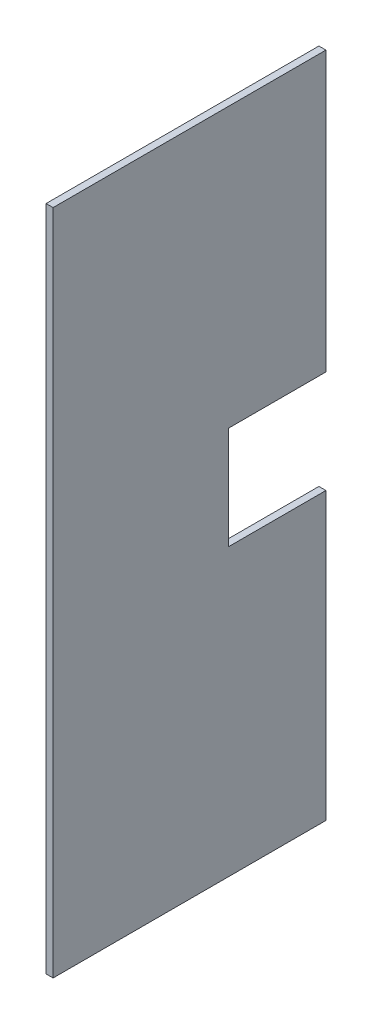
ISO-10303-21;
HEADER;
FILE_DESCRIPTION(('STEP AP214'),'2;1');
FILE_NAME('part.step','',(''),(''),'','','');
FILE_SCHEMA(('AUTOMOTIVE_DESIGN { 1 0 10303 214 1 1 1 1 }'));
ENDSEC;
DATA;
#1=APPLICATION_CONTEXT('core data for automotive mechanical design processes');
#2=APPLICATION_PROTOCOL_DEFINITION('international standard','automotive_design',2000,#1);
#3=PRODUCT_CONTEXT('',#1,'mechanical');
#4=PRODUCT('Part','Part','',(#3));
#5=PRODUCT_RELATED_PRODUCT_CATEGORY('part','',(#4));
#6=PRODUCT_DEFINITION_FORMATION('','',#4);
#7=PRODUCT_DEFINITION_CONTEXT('part definition',#1,'design');
#8=PRODUCT_DEFINITION('design','',#6,#7);
#9=PRODUCT_DEFINITION_SHAPE('','',#8);
#10=(LENGTH_UNIT() NAMED_UNIT(*) SI_UNIT(.MILLI.,.METRE.));
#11=(NAMED_UNIT(*) PLANE_ANGLE_UNIT() SI_UNIT($,.RADIAN.));
#12=(NAMED_UNIT(*) SI_UNIT($,.STERADIAN.) SOLID_ANGLE_UNIT());
#13=UNCERTAINTY_MEASURE_WITH_UNIT(LENGTH_MEASURE(1.E-05),#10,'distance_accuracy_value','');
#14=(GEOMETRIC_REPRESENTATION_CONTEXT(3) GLOBAL_UNCERTAINTY_ASSIGNED_CONTEXT((#13)) GLOBAL_UNIT_ASSIGNED_CONTEXT((#10,
#11,#12)) REPRESENTATION_CONTEXT('',''));
#15=CARTESIAN_POINT('',(0.,0.,0.));
#16=DIRECTION('',(0.,0.,1.));
#17=DIRECTION('',(1.,0.,0.));
#18=AXIS2_PLACEMENT_3D('',#15,#16,#17);
#19=CARTESIAN_POINT('',(1.,100.85,3.40000000000002));
#20=DIRECTION('',(0.,0.,-1.));
#21=DIRECTION('',(0.,1.,0.));
#22=AXIS2_PLACEMENT_3D('',#19,#20,#21);
#23=PLANE('',#22);
#24=DIRECTION('',(1.,0.,0.));
#25=VECTOR('',#24,1.);
#26=CARTESIAN_POINT('',(1.,61.1558991337893,3.40000000000002));
#27=LINE('',#26,#25);
#28=CARTESIAN_POINT('',(0.,61.1558991337893,3.40000000000002));
#29=VERTEX_POINT('',#28);
#30=CARTESIAN_POINT('',(1.,61.1558991337893,3.40000000000002));
#31=VERTEX_POINT('',#30);
#32=EDGE_CURVE('E140',#29,#31,#27,.T.);
#33=ORIENTED_EDGE('',*,*,#32,.F.);
#34=DIRECTION('',(0.,-1.,0.));
#35=VECTOR('',#34,1.);
#36=CARTESIAN_POINT('',(0.,5.85000000000011,3.40000000000002));
#37=LINE('',#36,#35);
#38=CARTESIAN_POINT('',(0.,100.85,3.40000000000002));
#39=VERTEX_POINT('',#38);
#40=EDGE_CURVE('E152',#39,#29,#37,.T.);
#41=ORIENTED_EDGE('',*,*,#40,.F.);
#42=DIRECTION('',(-1.,0.,0.));
#43=VECTOR('',#42,1.);
#44=CARTESIAN_POINT('',(1.,100.85,3.40000000000002));
#45=LINE('',#44,#43);
#46=CARTESIAN_POINT('',(1.,100.85,3.40000000000002));
#47=VERTEX_POINT('',#46);
#48=EDGE_CURVE('E179',#47,#39,#45,.T.);
#49=ORIENTED_EDGE('',*,*,#48,.F.);
#50=DIRECTION('',(0.,-1.,0.));
#51=VECTOR('',#50,1.);
#52=CARTESIAN_POINT('',(1.,100.85,3.40000000000002));
#53=LINE('',#52,#51);
#54=EDGE_CURVE('E172',#47,#31,#53,.T.);
#55=ORIENTED_EDGE('',*,*,#54,.T.);
#56=EDGE_LOOP('',(#33,#41,#49,#55));
#57=FACE_BOUND('',#56,.T.);
#58=ADVANCED_FACE('F38',(#57),#23,.T.);
#59=CARTESIAN_POINT('',(1.,5.85000000000011,3.40000000000003));
#60=DIRECTION('',(0.,-1.,0.));
#61=DIRECTION('',(0.,0.,-1.));
#62=AXIS2_PLACEMENT_3D('',#59,#60,#61);
#63=PLANE('',#62);
#64=DIRECTION('',(-1.,0.,0.));
#65=VECTOR('',#64,1.);
#66=CARTESIAN_POINT('',(1.,5.85000000000012,42.25));
#67=LINE('',#66,#65);
#68=CARTESIAN_POINT('',(1.,5.85000000000012,42.25));
#69=VERTEX_POINT('',#68);
#70=CARTESIAN_POINT('',(0.,5.85000000000012,42.25));
#71=VERTEX_POINT('',#70);
#72=EDGE_CURVE('E176',#69,#71,#67,.T.);
#73=ORIENTED_EDGE('',*,*,#72,.T.);
#74=DIRECTION('',(0.,0.,1.));
#75=VECTOR('',#74,1.);
#76=CARTESIAN_POINT('',(0.,5.85000000000012,42.25));
#77=LINE('',#76,#75);
#78=CARTESIAN_POINT('',(0.,5.85000000000011,3.40000000000002));
#79=VERTEX_POINT('',#78);
#80=EDGE_CURVE('E156',#79,#71,#77,.T.);
#81=ORIENTED_EDGE('',*,*,#80,.F.);
#82=DIRECTION('',(-1.,0.,0.));
#83=VECTOR('',#82,1.);
#84=CARTESIAN_POINT('',(1.,5.85000000000011,3.40000000000003));
#85=LINE('',#84,#83);
#86=CARTESIAN_POINT('',(1.,5.85000000000011,3.40000000000003));
#87=VERTEX_POINT('',#86);
#88=EDGE_CURVE('E47',#87,#79,#85,.T.);
#89=ORIENTED_EDGE('',*,*,#88,.F.);
#90=DIRECTION('',(0.,0.,1.));
#91=VECTOR('',#90,1.);
#92=CARTESIAN_POINT('',(1.,5.85000000000011,3.40000000000003));
#93=LINE('',#92,#91);
#94=EDGE_CURVE('E160',#87,#69,#93,.T.);
#95=ORIENTED_EDGE('',*,*,#94,.T.);
#96=EDGE_LOOP('',(#73,#81,#89,#95));
#97=FACE_BOUND('',#96,.T.);
#98=ADVANCED_FACE('F40',(#97),#63,.T.);
#99=DIRECTION('',(-1.,0.,0.));
#100=VECTOR('',#99,1.);
#101=CARTESIAN_POINT('',(1.,46.5418524919698,3.40000000000002));
#102=LINE('',#101,#100);
#103=CARTESIAN_POINT('',(1.,46.5418524919698,3.40000000000003));
#104=VERTEX_POINT('',#103);
#105=CARTESIAN_POINT('',(0.,46.541852795905,3.40000000000002));
#106=VERTEX_POINT('',#105);
#107=EDGE_CURVE('E54',#104,#106,#102,.T.);
#108=ORIENTED_EDGE('',*,*,#107,.F.);
#109=EDGE_CURVE('E60',#104,#87,#53,.T.);
#110=ORIENTED_EDGE('',*,*,#109,.T.);
#111=ORIENTED_EDGE('',*,*,#88,.T.);
#112=EDGE_CURVE('E151',#106,#79,#37,.T.);
#113=ORIENTED_EDGE('',*,*,#112,.F.);
#114=EDGE_LOOP('',(#108,#110,#111,#113));
#115=FACE_BOUND('',#114,.T.);
#116=ADVANCED_FACE('F206',(#115),#23,.T.);
#117=CARTESIAN_POINT('',(1.,100.85,42.25));
#118=DIRECTION('',(0.,1.,0.));
#119=DIRECTION('',(0.,0.,1.));
#120=AXIS2_PLACEMENT_3D('',#117,#118,#119);
#121=PLANE('',#120);
#122=ORIENTED_EDGE('',*,*,#48,.T.);
#123=DIRECTION('',(0.,0.,-1.));
#124=VECTOR('',#123,1.);
#125=CARTESIAN_POINT('',(0.,100.85,3.40000000000002));
#126=LINE('',#125,#124);
#127=CARTESIAN_POINT('',(0.,100.85,42.25));
#128=VERTEX_POINT('',#127);
#129=EDGE_CURVE('E147',#128,#39,#126,.T.);
#130=ORIENTED_EDGE('',*,*,#129,.F.);
#131=DIRECTION('',(-1.,0.,0.));
#132=VECTOR('',#131,1.);
#133=CARTESIAN_POINT('',(1.,100.85,42.25));
#134=LINE('',#133,#132);
#135=CARTESIAN_POINT('',(1.,100.85,42.25));
#136=VERTEX_POINT('',#135);
#137=EDGE_CURVE('E182',#136,#128,#134,.T.);
#138=ORIENTED_EDGE('',*,*,#137,.F.);
#139=DIRECTION('',(0.,0.,-1.));
#140=VECTOR('',#139,1.);
#141=CARTESIAN_POINT('',(1.,100.85,42.25));
#142=LINE('',#141,#140);
#143=EDGE_CURVE('E168',#136,#47,#142,.T.);
#144=ORIENTED_EDGE('',*,*,#143,.T.);
#145=EDGE_LOOP('',(#122,#130,#138,#144));
#146=FACE_BOUND('',#145,.T.);
#147=ADVANCED_FACE('F198',(#146),#121,.T.);
#148=CARTESIAN_POINT('',(1.,5.85000000000012,42.25));
#149=DIRECTION('',(0.,0.,1.));
#150=DIRECTION('',(0.,-1.,0.));
#151=AXIS2_PLACEMENT_3D('',#148,#149,#150);
#152=PLANE('',#151);
#153=ORIENTED_EDGE('',*,*,#137,.T.);
#154=DIRECTION('',(0.,1.,0.));
#155=VECTOR('',#154,1.);
#156=CARTESIAN_POINT('',(0.,100.85,42.25));
#157=LINE('',#156,#155);
#158=EDGE_CURVE('E143',#71,#128,#157,.T.);
#159=ORIENTED_EDGE('',*,*,#158,.F.);
#160=ORIENTED_EDGE('',*,*,#72,.F.);
#161=DIRECTION('',(0.,1.,0.));
#162=VECTOR('',#161,1.);
#163=CARTESIAN_POINT('',(1.,5.85000000000012,42.25));
#164=LINE('',#163,#162);
#165=EDGE_CURVE('E164',#69,#136,#164,.T.);
#166=ORIENTED_EDGE('',*,*,#165,.T.);
#167=EDGE_LOOP('',(#153,#159,#160,#166));
#168=FACE_BOUND('',#167,.T.);
#169=ADVANCED_FACE('F194',(#168),#152,.T.);
#170=CARTESIAN_POINT('',(1.,0.,0.));
#171=DIRECTION('',(-1.,0.,0.));
#172=DIRECTION('',(0.,0.,1.));
#173=AXIS2_PLACEMENT_3D('',#170,#171,#172);
#174=PLANE('',#173);
#175=DIRECTION('',(0.,0.999999999999999,-4.37114050709792E-08));
#176=VECTOR('',#175,1.);
#177=CARTESIAN_POINT('',(1.,46.5418530998402,17.3065609769447));
#178=LINE('',#177,#176);
#179=CARTESIAN_POINT('',(1.,46.5418530998402,17.3065609769447));
#180=VERTEX_POINT('',#179);
#181=CARTESIAN_POINT('',(1.,61.1558997416626,17.3065603381442));
#182=VERTEX_POINT('',#181);
#183=EDGE_CURVE('E115',#180,#182,#178,.T.);
#184=ORIENTED_EDGE('',*,*,#183,.T.);
#185=DIRECTION('',(0.,-4.37112610815E-08,-0.999999999999999));
#186=VECTOR('',#185,1.);
#187=CARTESIAN_POINT('',(1.,61.1558987523328,-5.32673278321498));
#188=LINE('',#187,#186);
#189=EDGE_CURVE('E112',#182,#31,#188,.T.);
#190=ORIENTED_EDGE('',*,*,#189,.T.);
#191=ORIENTED_EDGE('',*,*,#54,.F.);
#192=ORIENTED_EDGE('',*,*,#143,.F.);
#193=ORIENTED_EDGE('',*,*,#165,.F.);
#194=ORIENTED_EDGE('',*,*,#94,.F.);
#195=ORIENTED_EDGE('',*,*,#109,.F.);
#196=DIRECTION('',(0.,4.37110532135107E-08,0.999999999999999));
#197=VECTOR('',#196,1.);
#198=CARTESIAN_POINT('',(1.,46.5418521105151,-5.32673278321498));
#199=LINE('',#198,#197);
#200=EDGE_CURVE('E106',#104,#180,#199,.T.);
#201=ORIENTED_EDGE('',*,*,#200,.T.);
#202=EDGE_LOOP('',(#184,#190,#191,#192,#193,#194,#195,#201));
#203=FACE_BOUND('',#202,.T.);
#204=ADVANCED_FACE('F122',(#203),#174,.F.);
#205=CARTESIAN_POINT('',(0.,0.,0.));
#206=DIRECTION('',(1.,0.,0.));
#207=DIRECTION('',(0.,0.,-1.));
#208=AXIS2_PLACEMENT_3D('',#205,#206,#207);
#209=PLANE('',#208);
#210=ORIENTED_EDGE('',*,*,#40,.T.);
#211=DIRECTION('',(0.,-4.37112610815E-08,-0.999999999999999));
#212=VECTOR('',#211,1.);
#213=CARTESIAN_POINT('',(0.,61.1558987523328,-5.32673278321498));
#214=LINE('',#213,#212);
#215=CARTESIAN_POINT('',(0.,61.1558997416626,17.3065603381442));
#216=VERTEX_POINT('',#215);
#217=EDGE_CURVE('E125',#216,#29,#214,.T.);
#218=ORIENTED_EDGE('',*,*,#217,.F.);
#219=DIRECTION('',(0.,0.999999999999999,-4.37114050709792E-08));
#220=VECTOR('',#219,1.);
#221=CARTESIAN_POINT('',(0.,46.5418530998402,17.3065609769447));
#222=LINE('',#221,#220);
#223=CARTESIAN_POINT('',(0.,46.5418530998402,17.3065609769447));
#224=VERTEX_POINT('',#223);
#225=EDGE_CURVE('E129',#224,#216,#222,.T.);
#226=ORIENTED_EDGE('',*,*,#225,.F.);
#227=DIRECTION('',(0.,-4.37110532135107E-08,-0.999999999999999));
#228=VECTOR('',#227,1.);
#229=CARTESIAN_POINT('',(0.,46.5418523433521,-2.03439338443562E-06));
#230=LINE('',#229,#228);
#231=EDGE_CURVE('E11',#224,#106,#230,.T.);
#232=ORIENTED_EDGE('',*,*,#231,.T.);
#233=ORIENTED_EDGE('',*,*,#112,.T.);
#234=ORIENTED_EDGE('',*,*,#80,.T.);
#235=ORIENTED_EDGE('',*,*,#158,.T.);
#236=ORIENTED_EDGE('',*,*,#129,.T.);
#237=EDGE_LOOP('',(#210,#218,#226,#232,#233,#234,#235,#236));
#238=FACE_BOUND('',#237,.T.);
#239=ADVANCED_FACE('F192',(#238),#209,.F.);
#240=CARTESIAN_POINT('',(1.,61.1558987523328,-5.32673278321498));
#241=DIRECTION('',(0.,0.999999999999999,-4.37112610815001E-08));
#242=DIRECTION('',(0.,4.37112610815001E-08,0.999999999999999));
#243=AXIS2_PLACEMENT_3D('',#240,#241,#242);
#244=PLANE('',#243);
#245=ORIENTED_EDGE('',*,*,#32,.T.);
#246=ORIENTED_EDGE('',*,*,#189,.F.);
#247=DIRECTION('',(-1.,0.,0.));
#248=VECTOR('',#247,1.);
#249=CARTESIAN_POINT('',(1.,61.1558997416626,17.3065603381442));
#250=LINE('',#249,#248);
#251=EDGE_CURVE('E111',#182,#216,#250,.T.);
#252=ORIENTED_EDGE('',*,*,#251,.T.);
#253=ORIENTED_EDGE('',*,*,#217,.T.);
#254=EDGE_LOOP('',(#245,#246,#252,#253));
#255=FACE_BOUND('',#254,.T.);
#256=ADVANCED_FACE('F205',(#255),#244,.F.);
#257=CARTESIAN_POINT('',(1.,46.5418530998402,17.3065609769447));
#258=DIRECTION('',(0.,4.37114050709792E-08,0.999999999999999));
#259=DIRECTION('',(0.,-0.999999999999999,4.37114050709792E-08));
#260=AXIS2_PLACEMENT_3D('',#257,#258,#259);
#261=PLANE('',#260);
#262=ORIENTED_EDGE('',*,*,#225,.T.);
#263=ORIENTED_EDGE('',*,*,#251,.F.);
#264=ORIENTED_EDGE('',*,*,#183,.F.);
#265=DIRECTION('',(-1.,0.,0.));
#266=VECTOR('',#265,1.);
#267=CARTESIAN_POINT('',(1.,46.5418530998402,17.3065609769447));
#268=LINE('',#267,#266);
#269=EDGE_CURVE('E102',#180,#224,#268,.T.);
#270=ORIENTED_EDGE('',*,*,#269,.T.);
#271=EDGE_LOOP('',(#262,#263,#264,#270));
#272=FACE_BOUND('',#271,.T.);
#273=ADVANCED_FACE('F116',(#272),#261,.F.);
#274=CARTESIAN_POINT('',(1.,46.5418521105151,-5.32673278321498));
#275=DIRECTION('',(0.,-0.999999999999999,4.37110532135107E-08));
#276=DIRECTION('',(0.,-4.37110532135107E-08,-0.999999999999999));
#277=AXIS2_PLACEMENT_3D('',#274,#275,#276);
#278=PLANE('',#277);
#279=ORIENTED_EDGE('',*,*,#107,.T.);
#280=ORIENTED_EDGE('',*,*,#231,.F.);
#281=ORIENTED_EDGE('',*,*,#269,.F.);
#282=ORIENTED_EDGE('',*,*,#200,.F.);
#283=EDGE_LOOP('',(#279,#280,#281,#282));
#284=FACE_BOUND('',#283,.T.);
#285=ADVANCED_FACE('F104',(#284),#278,.F.);
#286=CLOSED_SHELL('',(#58,#98,#116,#147,#169,#204,#239,#256,#273,#285));
#287=MANIFOLD_SOLID_BREP('B2',#286);
#288=ADVANCED_BREP_SHAPE_REPRESENTATION('',(#18,#287),#14);
#289=SHAPE_DEFINITION_REPRESENTATION(#9,#288);
ENDSEC;
END-ISO-10303-21;
